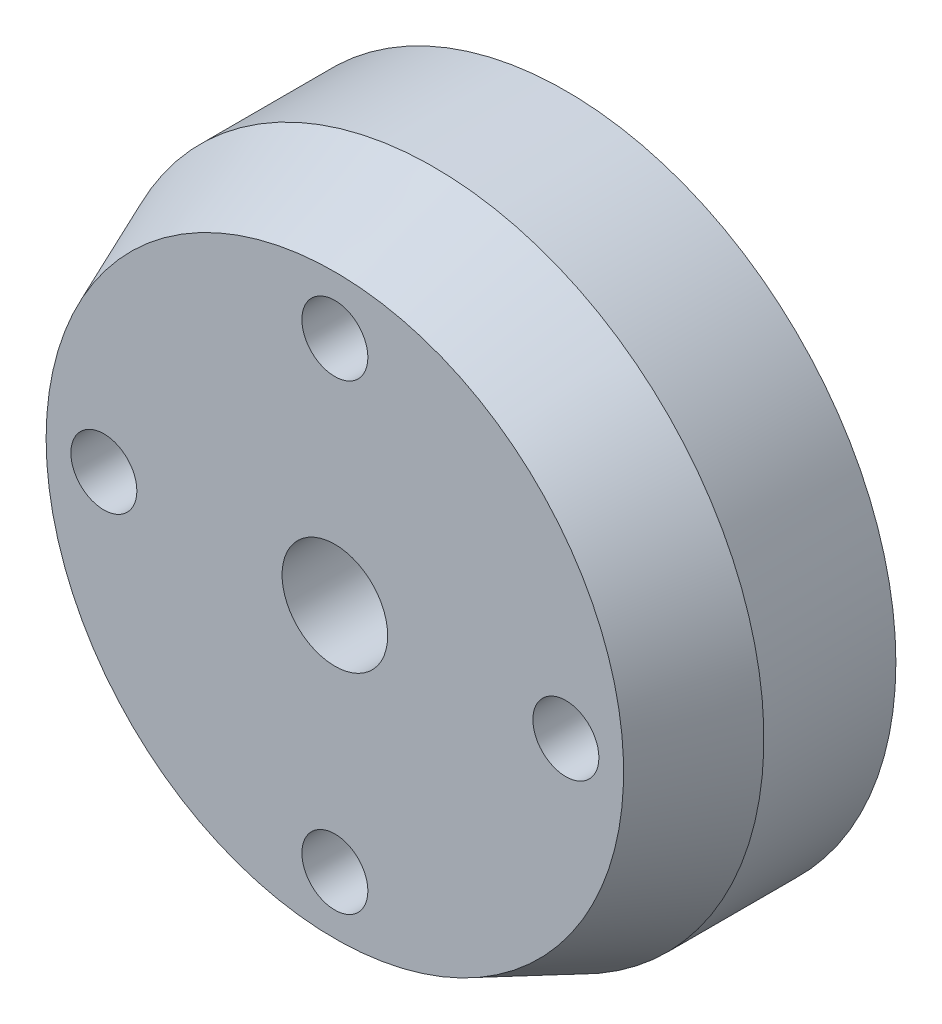
ISO-10303-21;
HEADER;
FILE_DESCRIPTION(('STEP AP214'),'2;1');
FILE_NAME('part.step','',(''),(''),'','','');
FILE_SCHEMA(('AUTOMOTIVE_DESIGN { 1 0 10303 214 1 1 1 1 }'));
ENDSEC;
DATA;
#1=APPLICATION_CONTEXT('core data for automotive mechanical design processes');
#2=APPLICATION_PROTOCOL_DEFINITION('international standard','automotive_design',2000,#1);
#3=PRODUCT_CONTEXT('',#1,'mechanical');
#4=PRODUCT('Part','Part','',(#3));
#5=PRODUCT_RELATED_PRODUCT_CATEGORY('part','',(#4));
#6=PRODUCT_DEFINITION_FORMATION('','',#4);
#7=PRODUCT_DEFINITION_CONTEXT('part definition',#1,'design');
#8=PRODUCT_DEFINITION('design','',#6,#7);
#9=PRODUCT_DEFINITION_SHAPE('','',#8);
#10=(LENGTH_UNIT() NAMED_UNIT(*) SI_UNIT(.MILLI.,.METRE.));
#11=(NAMED_UNIT(*) PLANE_ANGLE_UNIT() SI_UNIT($,.RADIAN.));
#12=(NAMED_UNIT(*) SI_UNIT($,.STERADIAN.) SOLID_ANGLE_UNIT());
#13=UNCERTAINTY_MEASURE_WITH_UNIT(LENGTH_MEASURE(1.E-05),#10,'distance_accuracy_value','');
#14=(GEOMETRIC_REPRESENTATION_CONTEXT(3) GLOBAL_UNCERTAINTY_ASSIGNED_CONTEXT((#13)) GLOBAL_UNIT_ASSIGNED_CONTEXT((#10,
#11,#12)) REPRESENTATION_CONTEXT('',''));
#15=CARTESIAN_POINT('',(0.,0.,0.));
#16=DIRECTION('',(0.,0.,1.));
#17=DIRECTION('',(1.,0.,0.));
#18=AXIS2_PLACEMENT_3D('',#15,#16,#17);
#19=CARTESIAN_POINT('',(0.,0.,7.));
#20=DIRECTION('',(0.,0.,1.));
#21=DIRECTION('',(1.,0.,0.));
#22=AXIS2_PLACEMENT_3D('',#19,#20,#21);
#23=PLANE('',#22);
#24=CARTESIAN_POINT('',(0.,0.,7.));
#25=DIRECTION('',(0.,0.,1.));
#26=DIRECTION('',(1.,0.,0.));
#27=AXIS2_PLACEMENT_3D('',#24,#25,#26);
#28=CIRCLE('',#27,8.75);
#29=CARTESIAN_POINT('',(-8.75,0.,7.));
#30=VERTEX_POINT('',#29);
#31=EDGE_CURVE('E42',#30,#30,#28,.T.);
#32=ORIENTED_EDGE('',*,*,#31,.T.);
#33=EDGE_LOOP('',(#32));
#34=FACE_BOUND('',#33,.T.);
#35=CARTESIAN_POINT('',(7.,0.,7.));
#36=DIRECTION('',(0.,0.,1.));
#37=DIRECTION('',(1.,0.,0.));
#38=AXIS2_PLACEMENT_3D('',#35,#36,#37);
#39=CIRCLE('',#38,1.);
#40=CARTESIAN_POINT('',(8.,0.,7.));
#41=VERTEX_POINT('',#40);
#42=EDGE_CURVE('E77',#41,#41,#39,.T.);
#43=ORIENTED_EDGE('',*,*,#42,.F.);
#44=EDGE_LOOP('',(#43));
#45=FACE_BOUND('',#44,.T.);
#46=CARTESIAN_POINT('',(0.,-7.,7.));
#47=DIRECTION('',(0.,0.,1.));
#48=DIRECTION('',(1.,0.,0.));
#49=AXIS2_PLACEMENT_3D('',#46,#47,#48);
#50=CIRCLE('',#49,1.);
#51=CARTESIAN_POINT('',(0.999999999999977,-7.,7.));
#52=VERTEX_POINT('',#51);
#53=EDGE_CURVE('E71',#52,#52,#50,.T.);
#54=ORIENTED_EDGE('',*,*,#53,.F.);
#55=EDGE_LOOP('',(#54));
#56=FACE_BOUND('',#55,.T.);
#57=CARTESIAN_POINT('',(-7.,0.,7.));
#58=DIRECTION('',(0.,0.,1.));
#59=DIRECTION('',(1.,0.,0.));
#60=AXIS2_PLACEMENT_3D('',#57,#58,#59);
#61=CIRCLE('',#60,1.);
#62=CARTESIAN_POINT('',(-6.,0.,7.));
#63=VERTEX_POINT('',#62);
#64=EDGE_CURVE('E65',#63,#63,#61,.T.);
#65=ORIENTED_EDGE('',*,*,#64,.F.);
#66=EDGE_LOOP('',(#65));
#67=FACE_BOUND('',#66,.T.);
#68=CARTESIAN_POINT('',(0.,7.,7.));
#69=DIRECTION('',(0.,0.,1.));
#70=DIRECTION('',(1.,0.,0.));
#71=AXIS2_PLACEMENT_3D('',#68,#69,#70);
#72=CIRCLE('',#71,1.);
#73=CARTESIAN_POINT('',(1.00000000000007,7.,7.));
#74=VERTEX_POINT('',#73);
#75=EDGE_CURVE('E59',#74,#74,#72,.T.);
#76=ORIENTED_EDGE('',*,*,#75,.F.);
#77=EDGE_LOOP('',(#76));
#78=FACE_BOUND('',#77,.T.);
#79=CARTESIAN_POINT('',(0.,0.,7.));
#80=DIRECTION('',(0.,0.,1.));
#81=DIRECTION('',(1.,0.,0.));
#82=AXIS2_PLACEMENT_3D('',#79,#80,#81);
#83=CIRCLE('',#82,1.6);
#84=CARTESIAN_POINT('',(1.6,0.,7.));
#85=VERTEX_POINT('',#84);
#86=EDGE_CURVE('E50',#85,#85,#83,.T.);
#87=ORIENTED_EDGE('',*,*,#86,.F.);
#88=EDGE_LOOP('',(#87));
#89=FACE_BOUND('',#88,.T.);
#90=ADVANCED_FACE('F34',(#34,#45,#56,#67,#78,#89),#23,.T.);
#91=CARTESIAN_POINT('',(0.,0.,0.));
#92=DIRECTION('',(0.,0.,1.));
#93=DIRECTION('',(1.,0.,0.));
#94=AXIS2_PLACEMENT_3D('',#91,#92,#93);
#95=PLANE('',#94);
#96=CARTESIAN_POINT('',(7.,0.,0.));
#97=DIRECTION('',(0.,0.,1.));
#98=DIRECTION('',(1.,0.,0.));
#99=AXIS2_PLACEMENT_3D('',#96,#97,#98);
#100=CIRCLE('',#99,1.);
#101=CARTESIAN_POINT('',(8.,0.,0.));
#102=VERTEX_POINT('',#101);
#103=EDGE_CURVE('E56',#102,#102,#100,.T.);
#104=ORIENTED_EDGE('',*,*,#103,.T.);
#105=EDGE_LOOP('',(#104));
#106=FACE_BOUND('',#105,.T.);
#107=CARTESIAN_POINT('',(0.,-7.,0.));
#108=DIRECTION('',(0.,0.,1.));
#109=DIRECTION('',(1.,0.,0.));
#110=AXIS2_PLACEMENT_3D('',#107,#108,#109);
#111=CIRCLE('',#110,1.);
#112=CARTESIAN_POINT('',(0.999999999999977,-7.,0.));
#113=VERTEX_POINT('',#112);
#114=EDGE_CURVE('E74',#113,#113,#111,.T.);
#115=ORIENTED_EDGE('',*,*,#114,.T.);
#116=EDGE_LOOP('',(#115));
#117=FACE_BOUND('',#116,.T.);
#118=CARTESIAN_POINT('',(-7.,0.,0.));
#119=DIRECTION('',(0.,0.,1.));
#120=DIRECTION('',(1.,0.,0.));
#121=AXIS2_PLACEMENT_3D('',#118,#119,#120);
#122=CIRCLE('',#121,1.);
#123=CARTESIAN_POINT('',(-6.,0.,0.));
#124=VERTEX_POINT('',#123);
#125=EDGE_CURVE('E68',#124,#124,#122,.T.);
#126=ORIENTED_EDGE('',*,*,#125,.T.);
#127=EDGE_LOOP('',(#126));
#128=FACE_BOUND('',#127,.T.);
#129=CARTESIAN_POINT('',(0.,7.,0.));
#130=DIRECTION('',(0.,0.,1.));
#131=DIRECTION('',(1.,0.,0.));
#132=AXIS2_PLACEMENT_3D('',#129,#130,#131);
#133=CIRCLE('',#132,1.);
#134=CARTESIAN_POINT('',(1.00000000000007,7.,0.));
#135=VERTEX_POINT('',#134);
#136=EDGE_CURVE('E62',#135,#135,#133,.T.);
#137=ORIENTED_EDGE('',*,*,#136,.T.);
#138=EDGE_LOOP('',(#137));
#139=FACE_BOUND('',#138,.T.);
#140=CARTESIAN_POINT('',(0.,0.,0.));
#141=DIRECTION('',(0.,0.,1.));
#142=DIRECTION('',(1.,0.,0.));
#143=AXIS2_PLACEMENT_3D('',#140,#141,#142);
#144=CIRCLE('',#143,10.);
#145=CARTESIAN_POINT('',(10.,0.,0.));
#146=VERTEX_POINT('',#145);
#147=EDGE_CURVE('E46',#146,#146,#144,.T.);
#148=ORIENTED_EDGE('',*,*,#147,.F.);
#149=EDGE_LOOP('',(#148));
#150=FACE_BOUND('',#149,.T.);
#151=CARTESIAN_POINT('',(0.,0.,0.));
#152=DIRECTION('',(0.,0.,1.));
#153=DIRECTION('',(1.,0.,0.));
#154=AXIS2_PLACEMENT_3D('',#151,#152,#153);
#155=CIRCLE('',#154,1.6);
#156=CARTESIAN_POINT('',(1.6,0.,0.));
#157=VERTEX_POINT('',#156);
#158=EDGE_CURVE('E53',#157,#157,#155,.T.);
#159=ORIENTED_EDGE('',*,*,#158,.T.);
#160=EDGE_LOOP('',(#159));
#161=FACE_BOUND('',#160,.T.);
#162=ADVANCED_FACE('F83',(#106,#117,#128,#139,#150,#161),#95,.F.);
#163=CARTESIAN_POINT('',(0.,0.,7.));
#164=DIRECTION('',(0.,0.,-1.));
#165=DIRECTION('',(-1.,0.,0.));
#166=AXIS2_PLACEMENT_3D('',#163,#164,#165);
#167=CYLINDRICAL_SURFACE('',#166,10.);
#168=CARTESIAN_POINT('',(0.,0.,3.99999999999998));
#169=DIRECTION('',(0.,0.,1.));
#170=DIRECTION('',(1.,0.,0.));
#171=AXIS2_PLACEMENT_3D('',#168,#169,#170);
#172=CIRCLE('',#171,10.);
#173=CARTESIAN_POINT('',(-10.,0.,3.99999999999998));
#174=VERTEX_POINT('',#173);
#175=EDGE_CURVE('E10',#174,#174,#172,.F.);
#176=ORIENTED_EDGE('',*,*,#175,.T.);
#177=EDGE_LOOP('',(#176));
#178=FACE_BOUND('',#177,.T.);
#179=ORIENTED_EDGE('',*,*,#147,.T.);
#180=EDGE_LOOP('',(#179));
#181=FACE_BOUND('',#180,.T.);
#182=ADVANCED_FACE('F108',(#178,#181),#167,.T.);
#183=CARTESIAN_POINT('',(0.,0.,7.));
#184=DIRECTION('',(0.,0.,-1.));
#185=DIRECTION('',(-1.,0.,0.));
#186=AXIS2_PLACEMENT_3D('',#183,#184,#185);
#187=CYLINDRICAL_SURFACE('',#186,1.6);
#188=ORIENTED_EDGE('',*,*,#86,.T.);
#189=EDGE_LOOP('',(#188));
#190=FACE_BOUND('',#189,.T.);
#191=ORIENTED_EDGE('',*,*,#158,.F.);
#192=EDGE_LOOP('',(#191));
#193=FACE_BOUND('',#192,.T.);
#194=ADVANCED_FACE('F104',(#190,#193),#187,.F.);
#195=CARTESIAN_POINT('',(0.,7.,0.));
#196=DIRECTION('',(0.,0.,1.));
#197=DIRECTION('',(1.,0.,0.));
#198=AXIS2_PLACEMENT_3D('',#195,#196,#197);
#199=CYLINDRICAL_SURFACE('',#198,1.);
#200=ORIENTED_EDGE('',*,*,#136,.F.);
#201=EDGE_LOOP('',(#200));
#202=FACE_BOUND('',#201,.T.);
#203=ORIENTED_EDGE('',*,*,#75,.T.);
#204=EDGE_LOOP('',(#203));
#205=FACE_BOUND('',#204,.T.);
#206=ADVANCED_FACE('F107',(#202,#205),#199,.F.);
#207=CARTESIAN_POINT('',(-7.,0.,0.));
#208=DIRECTION('',(0.,0.,1.));
#209=DIRECTION('',(1.,0.,0.));
#210=AXIS2_PLACEMENT_3D('',#207,#208,#209);
#211=CYLINDRICAL_SURFACE('',#210,1.);
#212=ORIENTED_EDGE('',*,*,#125,.F.);
#213=EDGE_LOOP('',(#212));
#214=FACE_BOUND('',#213,.T.);
#215=ORIENTED_EDGE('',*,*,#64,.T.);
#216=EDGE_LOOP('',(#215));
#217=FACE_BOUND('',#216,.T.);
#218=ADVANCED_FACE('F120',(#214,#217),#211,.F.);
#219=CARTESIAN_POINT('',(0.,-7.,0.));
#220=DIRECTION('',(0.,0.,1.));
#221=DIRECTION('',(1.,0.,0.));
#222=AXIS2_PLACEMENT_3D('',#219,#220,#221);
#223=CYLINDRICAL_SURFACE('',#222,1.);
#224=ORIENTED_EDGE('',*,*,#114,.F.);
#225=EDGE_LOOP('',(#224));
#226=FACE_BOUND('',#225,.T.);
#227=ORIENTED_EDGE('',*,*,#53,.T.);
#228=EDGE_LOOP('',(#227));
#229=FACE_BOUND('',#228,.T.);
#230=ADVANCED_FACE('F89',(#226,#229),#223,.F.);
#231=CARTESIAN_POINT('',(7.,0.,0.));
#232=DIRECTION('',(0.,0.,1.));
#233=DIRECTION('',(1.,0.,0.));
#234=AXIS2_PLACEMENT_3D('',#231,#232,#233);
#235=CYLINDRICAL_SURFACE('',#234,1.);
#236=ORIENTED_EDGE('',*,*,#103,.F.);
#237=EDGE_LOOP('',(#236));
#238=FACE_BOUND('',#237,.T.);
#239=ORIENTED_EDGE('',*,*,#42,.T.);
#240=EDGE_LOOP('',(#239));
#241=FACE_BOUND('',#240,.T.);
#242=ADVANCED_FACE('F86',(#238,#241),#235,.F.);
#243=CARTESIAN_POINT('',(0.,0.,7.));
#244=DIRECTION('',(0.,0.,-1.));
#245=DIRECTION('',(-1.,0.,0.));
#246=AXIS2_PLACEMENT_3D('',#243,#244,#245);
#247=CONICAL_SURFACE('',#246,8.75,0.394791119699759);
#248=CARTESIAN_POINT('',(-10.,0.,3.99999999999998));
#249=CARTESIAN_POINT('',(-9.98697916666667,0.,4.03124999999998));
#250=CARTESIAN_POINT('',(-9.97395833333333,0.,4.06249999999998));
#251=CARTESIAN_POINT('',(-9.94791666666667,0.,4.12499999999998));
#252=CARTESIAN_POINT('',(-9.93489583333333,0.,4.15624999999998));
#253=CARTESIAN_POINT('',(-9.90885416666667,0.,4.21874999999998));
#254=CARTESIAN_POINT('',(-9.89583333333333,0.,4.24999999999998));
#255=CARTESIAN_POINT('',(-9.86979166666667,0.,4.31249999999998));
#256=CARTESIAN_POINT('',(-9.85677083333334,0.,4.34374999999998));
#257=CARTESIAN_POINT('',(-9.83072916666667,0.,4.40624999999998));
#258=CARTESIAN_POINT('',(-9.81770833333333,0.,4.43749999999998));
#259=CARTESIAN_POINT('',(-9.79166666666667,0.,4.49999999999998));
#260=CARTESIAN_POINT('',(-9.77864583333333,0.,4.53124999999998));
#261=CARTESIAN_POINT('',(-9.75260416666667,0.,4.59374999999998));
#262=CARTESIAN_POINT('',(-9.73958333333333,0.,4.62499999999998));
#263=CARTESIAN_POINT('',(-9.71354166666667,0.,4.68749999999998));
#264=CARTESIAN_POINT('',(-9.70052083333334,0.,4.71874999999998));
#265=CARTESIAN_POINT('',(-9.67447916666667,0.,4.78124999999998));
#266=CARTESIAN_POINT('',(-9.66145833333333,0.,4.81249999999998));
#267=CARTESIAN_POINT('',(-9.63541666666667,0.,4.87499999999998));
#268=CARTESIAN_POINT('',(-9.62239583333334,0.,4.90624999999998));
#269=CARTESIAN_POINT('',(-9.59635416666667,0.,4.96874999999998));
#270=CARTESIAN_POINT('',(-9.58333333333333,0.,4.99999999999998));
#271=CARTESIAN_POINT('',(-9.55729166666667,0.,5.06249999999998));
#272=CARTESIAN_POINT('',(-9.54427083333334,0.,5.09374999999998));
#273=CARTESIAN_POINT('',(-9.51822916666667,0.,5.15624999999998));
#274=CARTESIAN_POINT('',(-9.50520833333333,0.,5.18749999999999));
#275=CARTESIAN_POINT('',(-9.47916666666667,0.,5.24999999999999));
#276=CARTESIAN_POINT('',(-9.46614583333334,0.,5.28124999999999));
#277=CARTESIAN_POINT('',(-9.44010416666667,0.,5.34374999999999));
#278=CARTESIAN_POINT('',(-9.42708333333333,0.,5.37499999999999));
#279=CARTESIAN_POINT('',(-9.40104166666667,0.,5.43749999999999));
#280=CARTESIAN_POINT('',(-9.38802083333334,0.,5.46874999999999));
#281=CARTESIAN_POINT('',(-9.36197916666667,0.,5.53124999999999));
#282=CARTESIAN_POINT('',(-9.34895833333333,0.,5.56249999999999));
#283=CARTESIAN_POINT('',(-9.32291666666667,0.,5.62499999999999));
#284=CARTESIAN_POINT('',(-9.30989583333334,0.,5.65624999999999));
#285=CARTESIAN_POINT('',(-9.28385416666667,0.,5.71874999999999));
#286=CARTESIAN_POINT('',(-9.27083333333333,0.,5.74999999999999));
#287=CARTESIAN_POINT('',(-9.24479166666667,0.,5.81249999999999));
#288=CARTESIAN_POINT('',(-9.23177083333334,0.,5.84374999999999));
#289=CARTESIAN_POINT('',(-9.20572916666667,0.,5.90624999999999));
#290=CARTESIAN_POINT('',(-9.19270833333333,0.,5.93749999999999));
#291=CARTESIAN_POINT('',(-9.16666666666667,0.,5.99999999999999));
#292=CARTESIAN_POINT('',(-9.15364583333334,0.,6.03124999999999));
#293=CARTESIAN_POINT('',(-9.12760416666667,0.,6.09374999999999));
#294=CARTESIAN_POINT('',(-9.11458333333333,0.,6.12499999999999));
#295=CARTESIAN_POINT('',(-9.08854166666667,0.,6.18749999999999));
#296=CARTESIAN_POINT('',(-9.07552083333333,0.,6.21874999999999));
#297=CARTESIAN_POINT('',(-9.04947916666667,0.,6.28124999999999));
#298=CARTESIAN_POINT('',(-9.03645833333333,0.,6.31249999999999));
#299=CARTESIAN_POINT('',(-9.01041666666667,0.,6.37499999999999));
#300=CARTESIAN_POINT('',(-8.99739583333333,0.,6.40625));
#301=CARTESIAN_POINT('',(-8.97135416666667,0.,6.46875));
#302=CARTESIAN_POINT('',(-8.95833333333333,0.,6.5));
#303=CARTESIAN_POINT('',(-8.93229166666667,0.,6.5625));
#304=CARTESIAN_POINT('',(-8.91927083333333,0.,6.59375));
#305=CARTESIAN_POINT('',(-8.89322916666667,0.,6.65625));
#306=CARTESIAN_POINT('',(-8.88020833333334,0.,6.6875));
#307=CARTESIAN_POINT('',(-8.85416666666667,0.,6.75));
#308=CARTESIAN_POINT('',(-8.84114583333333,0.,6.78125));
#309=CARTESIAN_POINT('',(-8.81510416666667,0.,6.84375));
#310=CARTESIAN_POINT('',(-8.80208333333334,0.,6.875));
#311=CARTESIAN_POINT('',(-8.77604166666667,0.,6.9375));
#312=CARTESIAN_POINT('',(-8.76302083333333,0.,6.96875));
#313=CARTESIAN_POINT('',(-8.75,0.,7.));
#314=B_SPLINE_CURVE_WITH_KNOTS('',3,(#248,#249,#250,#251,#252,#253,#254,#255,#256,#257,#258,
#259,#260,#261,#262,#263,#264,#265,#266,#267,#268,#269,#270,#271,#272,#273,#274,#275,#276,#277,
#278,#279,#280,#281,#282,#283,#284,#285,#286,#287,#288,#289,#290,#291,#292,#293,#294,#295,#296,
#297,#298,#299,#300,#301,#302,#303,#304,#305,#306,#307,#308,#309,#310,#311,#312,#313),
.UNSPECIFIED.,.F.,.F.,(4,2,2,2,2,2,2,2,2,2,2,2,2,2,2,2,2,2,2,2,2,2,2,2,2,2,2,2,2,2,2,2,4),(0.,
0.1015625,0.203125000000001,0.304687500000002,0.406250000000001,0.507812500000003,
0.609375000000004,0.710937500000004,0.812500000000005,0.914062500000005,1.01562500000001,
1.11718750000001,1.21875000000001,1.32031250000001,1.42187500000001,1.52343750000001,
1.62500000000001,1.72656250000001,1.82812500000001,1.92968750000001,2.03125000000001,
2.13281250000001,2.23437500000001,2.33593750000002,2.43750000000002,2.53906250000002,
2.64062500000002,2.74218750000002,2.84375000000002,2.94531250000002,3.04687500000002,
3.14843750000002,3.25000000000002),.UNSPECIFIED.);
#315=EDGE_CURVE('BSEAM37',#174,#30,#314,.T.);
#316=ORIENTED_EDGE('',*,*,#175,.F.);
#317=ORIENTED_EDGE('',*,*,#31,.F.);
#318=ORIENTED_EDGE('',*,*,#315,.T.);
#319=ORIENTED_EDGE('',*,*,#315,.F.);
#320=EDGE_LOOP('',(#316,#318,#317,#319));
#321=FACE_BOUND('',#320,.T.);
#322=ADVANCED_FACE('F37',(#321),#247,.T.);
#323=CLOSED_SHELL('',(#90,#162,#182,#194,#206,#218,#230,#242,#322));
#324=MANIFOLD_SOLID_BREP('B2',#323);
#325=ADVANCED_BREP_SHAPE_REPRESENTATION('',(#18,#324),#14);
#326=SHAPE_DEFINITION_REPRESENTATION(#9,#325);
ENDSEC;
END-ISO-10303-21;
